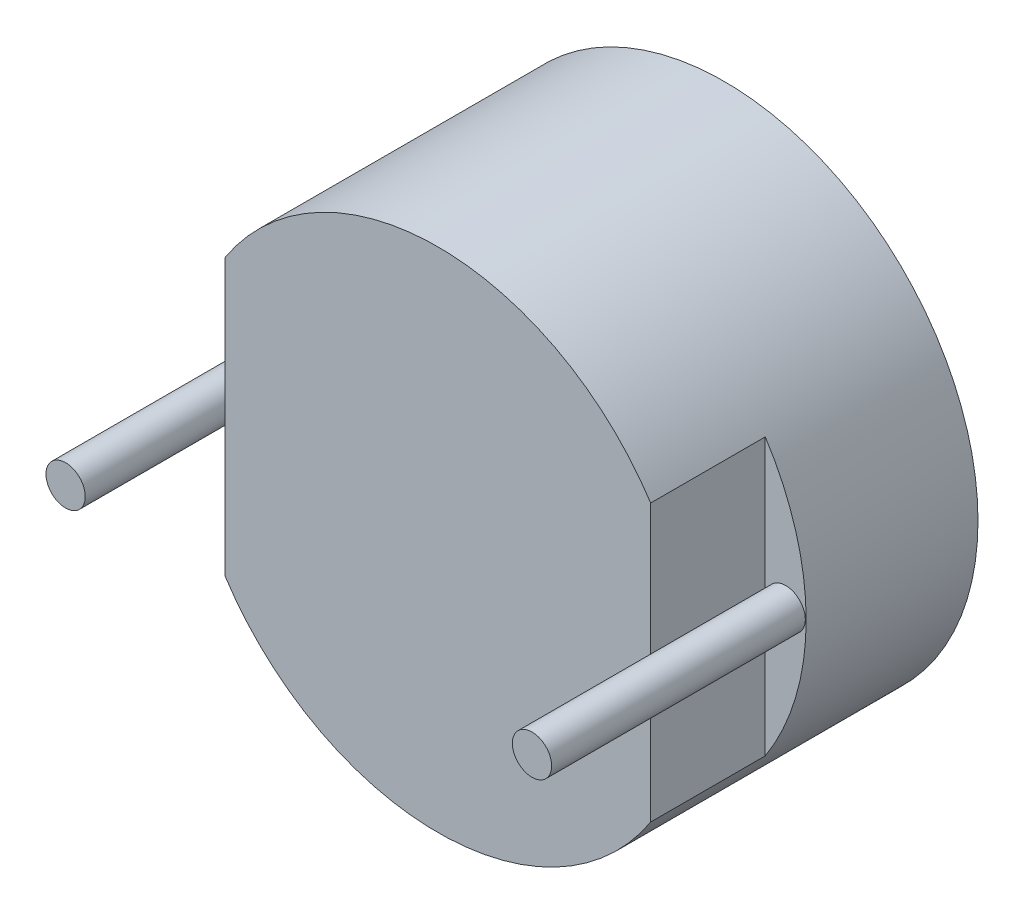
ISO-10303-21;
HEADER;
FILE_DESCRIPTION(('STEP AP214'),'2;1');
FILE_NAME('part.step','',(''),(''),'','','');
FILE_SCHEMA(('AUTOMOTIVE_DESIGN { 1 0 10303 214 1 1 1 1 }'));
ENDSEC;
DATA;
#1=APPLICATION_CONTEXT('core data for automotive mechanical design processes');
#2=APPLICATION_PROTOCOL_DEFINITION('international standard','automotive_design',2000,#1);
#3=PRODUCT_CONTEXT('',#1,'mechanical');
#4=PRODUCT('Part','Part','',(#3));
#5=PRODUCT_RELATED_PRODUCT_CATEGORY('part','',(#4));
#6=PRODUCT_DEFINITION_FORMATION('','',#4);
#7=PRODUCT_DEFINITION_CONTEXT('part definition',#1,'design');
#8=PRODUCT_DEFINITION('design','',#6,#7);
#9=PRODUCT_DEFINITION_SHAPE('','',#8);
#10=(LENGTH_UNIT() NAMED_UNIT(*) SI_UNIT(.MILLI.,.METRE.));
#11=(NAMED_UNIT(*) PLANE_ANGLE_UNIT() SI_UNIT($,.RADIAN.));
#12=(NAMED_UNIT(*) SI_UNIT($,.STERADIAN.) SOLID_ANGLE_UNIT());
#13=UNCERTAINTY_MEASURE_WITH_UNIT(LENGTH_MEASURE(1.E-05),#10,'distance_accuracy_value','');
#14=(GEOMETRIC_REPRESENTATION_CONTEXT(3) GLOBAL_UNCERTAINTY_ASSIGNED_CONTEXT((#13)) GLOBAL_UNIT_ASSIGNED_CONTEXT((#10,
#11,#12)) REPRESENTATION_CONTEXT('',''));
#15=CARTESIAN_POINT('',(0.,0.,0.));
#16=DIRECTION('',(0.,0.,1.));
#17=DIRECTION('',(1.,0.,0.));
#18=AXIS2_PLACEMENT_3D('',#15,#16,#17);
#19=CARTESIAN_POINT('',(-49.1532488000573,27.1636374947685,0.2));
#20=DIRECTION('',(0.,0.,-1.));
#21=DIRECTION('',(-1.,0.,0.));
#22=AXIS2_PLACEMENT_3D('',#19,#20,#21);
#23=PLANE('',#22);
#24=CARTESIAN_POINT('',(-49.1532488000573,27.1636374947685,0.2));
#25=DIRECTION('',(0.,0.,-1.));
#26=DIRECTION('',(-1.,0.,0.));
#27=AXIS2_PLACEMENT_3D('',#24,#25,#26);
#28=CIRCLE('',#27,2.9);
#29=CARTESIAN_POINT('',(-52.0532488000573,27.1636374947685,0.2));
#30=VERTEX_POINT('',#29);
#31=EDGE_CURVE('E179',#30,#30,#28,.T.);
#32=ORIENTED_EDGE('',*,*,#31,.T.);
#33=EDGE_LOOP('',(#32));
#34=FACE_BOUND('',#33,.T.);
#35=CARTESIAN_POINT('',(-49.1532488000573,27.1636374947685,0.2));
#36=DIRECTION('',(0.,0.,-1.));
#37=DIRECTION('',(-1.,0.,0.));
#38=AXIS2_PLACEMENT_3D('',#35,#36,#37);
#39=CIRCLE('',#38,1.675);
#40=CARTESIAN_POINT('',(-50.8282488000573,27.1636374947685,0.2));
#41=VERTEX_POINT('',#40);
#42=EDGE_CURVE('E186',#41,#41,#39,.T.);
#43=ORIENTED_EDGE('',*,*,#42,.F.);
#44=EDGE_LOOP('',(#43));
#45=FACE_BOUND('',#44,.T.);
#46=ADVANCED_FACE('F33',(#34,#45),#23,.T.);
#47=CARTESIAN_POINT('',(-49.1532488000573,27.1636374947685,2.1));
#48=DIRECTION('',(0.,0.,1.));
#49=DIRECTION('',(1.,0.,0.));
#50=AXIS2_PLACEMENT_3D('',#47,#48,#49);
#51=PLANE('',#50);
#52=DIRECTION('',(0.,1.,0.));
#53=VECTOR('',#52,1.);
#54=CARTESIAN_POINT('',(-51.7532488000573,27.1636374947685,2.1));
#55=LINE('',#54,#53);
#56=CARTESIAN_POINT('',(-51.7532488000573,25.4754431931551,2.1));
#57=VERTEX_POINT('',#56);
#58=CARTESIAN_POINT('',(-51.7532488000573,28.8518317963819,2.1));
#59=VERTEX_POINT('',#58);
#60=EDGE_CURVE('E75',#57,#59,#55,.T.);
#61=ORIENTED_EDGE('',*,*,#60,.T.);
#62=CARTESIAN_POINT('',(-49.1532488000573,27.1636374947685,2.1));
#63=DIRECTION('',(0.,0.,1.));
#64=DIRECTION('',(1.,0.,0.));
#65=AXIS2_PLACEMENT_3D('',#62,#63,#64);
#66=CIRCLE('',#65,3.1);
#67=EDGE_CURVE('E80',#59,#57,#66,.T.);
#68=ORIENTED_EDGE('',*,*,#67,.T.);
#69=EDGE_LOOP('',(#61,#68));
#70=FACE_BOUND('',#69,.T.);
#71=CARTESIAN_POINT('',(-52.0032488000573,27.1636374947685,2.1));
#72=DIRECTION('',(0.,0.,1.));
#73=DIRECTION('',(1.,0.,0.));
#74=AXIS2_PLACEMENT_3D('',#71,#72,#73);
#75=CIRCLE('',#74,0.239999999999996);
#76=CARTESIAN_POINT('',(-51.7632488000573,27.1636374947685,2.1));
#77=VERTEX_POINT('',#76);
#78=EDGE_CURVE('E175',#77,#77,#75,.T.);
#79=ORIENTED_EDGE('',*,*,#78,.F.);
#80=EDGE_LOOP('',(#79));
#81=FACE_BOUND('',#80,.T.);
#82=ADVANCED_FACE('F77',(#70,#81),#51,.T.);
#83=CARTESIAN_POINT('',(-49.1532488000573,27.1636374947685,2.1));
#84=DIRECTION('',(0.,0.,1.));
#85=DIRECTION('',(1.,0.,0.));
#86=AXIS2_PLACEMENT_3D('',#83,#84,#85);
#87=PLANE('',#86);
#88=DIRECTION('',(0.,-1.,0.));
#89=VECTOR('',#88,1.);
#90=CARTESIAN_POINT('',(-46.5532488000573,27.1636374947685,2.1));
#91=LINE('',#90,#89);
#92=CARTESIAN_POINT('',(-46.5532488000573,28.8518317963819,2.1));
#93=VERTEX_POINT('',#92);
#94=CARTESIAN_POINT('',(-46.5532488000573,25.4754431931551,2.1));
#95=VERTEX_POINT('',#94);
#96=EDGE_CURVE('E98',#93,#95,#91,.T.);
#97=ORIENTED_EDGE('',*,*,#96,.T.);
#98=CARTESIAN_POINT('',(-49.1532488000573,27.1636374947685,2.1));
#99=DIRECTION('',(0.,0.,1.));
#100=DIRECTION('',(1.,0.,0.));
#101=AXIS2_PLACEMENT_3D('',#98,#99,#100);
#102=CIRCLE('',#101,3.1);
#103=EDGE_CURVE('E100',#95,#93,#102,.T.);
#104=ORIENTED_EDGE('',*,*,#103,.T.);
#105=EDGE_LOOP('',(#97,#104));
#106=FACE_BOUND('',#105,.T.);
#107=CARTESIAN_POINT('',(-46.3032488000573,27.1636374947685,2.1));
#108=DIRECTION('',(0.,0.,1.));
#109=DIRECTION('',(1.,0.,0.));
#110=AXIS2_PLACEMENT_3D('',#107,#108,#109);
#111=CIRCLE('',#110,0.239999999999996);
#112=CARTESIAN_POINT('',(-46.0632488000573,27.1636374947685,2.1));
#113=VERTEX_POINT('',#112);
#114=EDGE_CURVE('E169',#113,#113,#111,.T.);
#115=ORIENTED_EDGE('',*,*,#114,.F.);
#116=EDGE_LOOP('',(#115));
#117=FACE_BOUND('',#116,.T.);
#118=ADVANCED_FACE('F131',(#106,#117),#87,.T.);
#119=CARTESIAN_POINT('',(-49.1532488000573,27.1636374947685,3.5));
#120=DIRECTION('',(0.,0.,-1.));
#121=DIRECTION('',(-1.,0.,0.));
#122=AXIS2_PLACEMENT_3D('',#119,#120,#121);
#123=CYLINDRICAL_SURFACE('',#122,3.1);
#124=CARTESIAN_POINT('',(-49.1532488000573,27.1636374947685,3.5));
#125=DIRECTION('',(0.,0.,1.));
#126=DIRECTION('',(1.,0.,0.));
#127=AXIS2_PLACEMENT_3D('',#124,#125,#126);
#128=CIRCLE('',#127,3.1);
#129=CARTESIAN_POINT('',(-51.7532488000573,25.4754431931551,3.5));
#130=VERTEX_POINT('',#129);
#131=CARTESIAN_POINT('',(-46.5532488000573,25.4754431931551,3.5));
#132=VERTEX_POINT('',#131);
#133=EDGE_CURVE('E42',#130,#132,#128,.T.);
#134=ORIENTED_EDGE('',*,*,#133,.F.);
#135=DIRECTION('',(0.,0.,1.));
#136=VECTOR('',#135,1.);
#137=CARTESIAN_POINT('',(-51.7532488000573,25.4754431931551,2.1));
#138=LINE('',#137,#136);
#139=EDGE_CURVE('E49',#57,#130,#138,.T.);
#140=ORIENTED_EDGE('',*,*,#139,.F.);
#141=ORIENTED_EDGE('',*,*,#67,.F.);
#142=DIRECTION('',(0.,0.,1.));
#143=VECTOR('',#142,1.);
#144=CARTESIAN_POINT('',(-51.7532488000573,28.8518317963819,2.1));
#145=LINE('',#144,#143);
#146=CARTESIAN_POINT('',(-51.7532488000573,28.8518317963819,3.5));
#147=VERTEX_POINT('',#146);
#148=EDGE_CURVE('E84',#59,#147,#145,.T.);
#149=ORIENTED_EDGE('',*,*,#148,.T.);
#150=CARTESIAN_POINT('',(-46.5532488000573,28.8518317963819,3.5));
#151=VERTEX_POINT('',#150);
#152=EDGE_CURVE('E11',#151,#147,#128,.T.);
#153=ORIENTED_EDGE('',*,*,#152,.F.);
#154=DIRECTION('',(0.,0.,1.));
#155=VECTOR('',#154,1.);
#156=CARTESIAN_POINT('',(-46.5532488000573,28.8518317963819,2.1));
#157=LINE('',#156,#155);
#158=EDGE_CURVE('E57',#93,#151,#157,.T.);
#159=ORIENTED_EDGE('',*,*,#158,.F.);
#160=ORIENTED_EDGE('',*,*,#103,.F.);
#161=DIRECTION('',(0.,0.,1.));
#162=VECTOR('',#161,1.);
#163=CARTESIAN_POINT('',(-46.5532488000573,25.4754431931551,2.1));
#164=LINE('',#163,#162);
#165=EDGE_CURVE('E103',#95,#132,#164,.T.);
#166=ORIENTED_EDGE('',*,*,#165,.T.);
#167=EDGE_LOOP('',(#134,#140,#141,#149,#153,#159,#160,#166));
#168=FACE_BOUND('',#167,.T.);
#169=CARTESIAN_POINT('',(-49.1532488000573,27.1636374947685,0.));
#170=DIRECTION('',(0.,0.,1.));
#171=DIRECTION('',(1.,0.,0.));
#172=AXIS2_PLACEMENT_3D('',#169,#170,#171);
#173=CIRCLE('',#172,3.1);
#174=CARTESIAN_POINT('',(-46.0532488000573,27.1636374947685,0.));
#175=VERTEX_POINT('',#174);
#176=EDGE_CURVE('E37',#175,#175,#173,.T.);
#177=ORIENTED_EDGE('',*,*,#176,.T.);
#178=EDGE_LOOP('',(#177));
#179=FACE_BOUND('',#178,.T.);
#180=ADVANCED_FACE('F35',(#168,#179),#123,.T.);
#181=CARTESIAN_POINT('',(-49.1532488000573,27.1636374947685,3.5));
#182=DIRECTION('',(0.,0.,1.));
#183=DIRECTION('',(1.,0.,0.));
#184=AXIS2_PLACEMENT_3D('',#181,#182,#183);
#185=PLANE('',#184);
#186=DIRECTION('',(0.,1.,0.));
#187=VECTOR('',#186,1.);
#188=CARTESIAN_POINT('',(-51.7532488000573,27.1636374947685,3.5));
#189=LINE('',#188,#187);
#190=EDGE_CURVE('E81',#130,#147,#189,.T.);
#191=ORIENTED_EDGE('',*,*,#190,.F.);
#192=ORIENTED_EDGE('',*,*,#133,.T.);
#193=DIRECTION('',(0.,-1.,0.));
#194=VECTOR('',#193,1.);
#195=CARTESIAN_POINT('',(-46.5532488000573,27.1636374947685,3.5));
#196=LINE('',#195,#194);
#197=EDGE_CURVE('E96',#151,#132,#196,.T.);
#198=ORIENTED_EDGE('',*,*,#197,.F.);
#199=ORIENTED_EDGE('',*,*,#152,.T.);
#200=EDGE_LOOP('',(#191,#192,#198,#199));
#201=FACE_BOUND('',#200,.T.);
#202=ADVANCED_FACE('F111',(#201),#185,.T.);
#203=CARTESIAN_POINT('',(-49.1532488000573,27.1636374947685,0.));
#204=DIRECTION('',(0.,0.,1.));
#205=DIRECTION('',(1.,0.,0.));
#206=AXIS2_PLACEMENT_3D('',#203,#204,#205);
#207=PLANE('',#206);
#208=CARTESIAN_POINT('',(-49.1532488000573,27.1636374947685,0.));
#209=DIRECTION('',(0.,0.,-1.));
#210=DIRECTION('',(-1.,0.,0.));
#211=AXIS2_PLACEMENT_3D('',#208,#209,#210);
#212=CIRCLE('',#211,2.9);
#213=CARTESIAN_POINT('',(-52.0532488000573,27.1636374947685,0.));
#214=VERTEX_POINT('',#213);
#215=EDGE_CURVE('E181',#214,#214,#212,.T.);
#216=ORIENTED_EDGE('',*,*,#215,.F.);
#217=EDGE_LOOP('',(#216));
#218=FACE_BOUND('',#217,.T.);
#219=ORIENTED_EDGE('',*,*,#176,.F.);
#220=EDGE_LOOP('',(#219));
#221=FACE_BOUND('',#220,.T.);
#222=ADVANCED_FACE('F115',(#218,#221),#207,.F.);
#223=CARTESIAN_POINT('',(-46.5532488000573,27.1636374947685,2.1));
#224=DIRECTION('',(-1.,0.,0.));
#225=DIRECTION('',(0.,0.,1.));
#226=AXIS2_PLACEMENT_3D('',#223,#224,#225);
#227=PLANE('',#226);
#228=ORIENTED_EDGE('',*,*,#197,.T.);
#229=ORIENTED_EDGE('',*,*,#165,.F.);
#230=ORIENTED_EDGE('',*,*,#96,.F.);
#231=ORIENTED_EDGE('',*,*,#158,.T.);
#232=EDGE_LOOP('',(#228,#229,#230,#231));
#233=FACE_BOUND('',#232,.T.);
#234=ADVANCED_FACE('F109',(#233),#227,.F.);
#235=CARTESIAN_POINT('',(-51.7532488000573,27.1636374947685,2.1));
#236=DIRECTION('',(1.,0.,0.));
#237=DIRECTION('',(0.,0.,-1.));
#238=AXIS2_PLACEMENT_3D('',#235,#236,#237);
#239=PLANE('',#238);
#240=ORIENTED_EDGE('',*,*,#190,.T.);
#241=ORIENTED_EDGE('',*,*,#148,.F.);
#242=ORIENTED_EDGE('',*,*,#60,.F.);
#243=ORIENTED_EDGE('',*,*,#139,.T.);
#244=EDGE_LOOP('',(#240,#241,#242,#243));
#245=FACE_BOUND('',#244,.T.);
#246=ADVANCED_FACE('F85',(#245),#239,.F.);
#247=CARTESIAN_POINT('',(-46.3032488000573,27.1636374947685,5.2));
#248=DIRECTION('',(0.,0.,-1.));
#249=DIRECTION('',(-1.,0.,0.));
#250=AXIS2_PLACEMENT_3D('',#247,#248,#249);
#251=CYLINDRICAL_SURFACE('',#250,0.239999999999996);
#252=CARTESIAN_POINT('',(-46.3032488000573,27.1636374947685,5.2));
#253=DIRECTION('',(0.,0.,1.));
#254=DIRECTION('',(1.,0.,0.));
#255=AXIS2_PLACEMENT_3D('',#252,#253,#254);
#256=CIRCLE('',#255,0.239999999999996);
#257=CARTESIAN_POINT('',(-46.0632488000573,27.1636374947685,5.2));
#258=VERTEX_POINT('',#257);
#259=EDGE_CURVE('E95',#258,#258,#256,.T.);
#260=ORIENTED_EDGE('',*,*,#259,.F.);
#261=EDGE_LOOP('',(#260));
#262=FACE_BOUND('',#261,.T.);
#263=ORIENTED_EDGE('',*,*,#114,.T.);
#264=EDGE_LOOP('',(#263));
#265=FACE_BOUND('',#264,.T.);
#266=ADVANCED_FACE('F154',(#262,#265),#251,.T.);
#267=CARTESIAN_POINT('',(-46.3032488000573,27.1636374947685,5.2));
#268=DIRECTION('',(0.,0.,1.));
#269=DIRECTION('',(1.,0.,0.));
#270=AXIS2_PLACEMENT_3D('',#267,#268,#269);
#271=PLANE('',#270);
#272=ORIENTED_EDGE('',*,*,#259,.T.);
#273=EDGE_LOOP('',(#272));
#274=FACE_BOUND('',#273,.T.);
#275=ADVANCED_FACE('F150',(#274),#271,.T.);
#276=CARTESIAN_POINT('',(-52.0032488000573,27.1636374947685,5.2));
#277=DIRECTION('',(0.,0.,-1.));
#278=DIRECTION('',(-1.,0.,0.));
#279=AXIS2_PLACEMENT_3D('',#276,#277,#278);
#280=CYLINDRICAL_SURFACE('',#279,0.239999999999996);
#281=CARTESIAN_POINT('',(-52.0032488000573,27.1636374947685,5.2));
#282=DIRECTION('',(0.,0.,1.));
#283=DIRECTION('',(1.,0.,0.));
#284=AXIS2_PLACEMENT_3D('',#281,#282,#283);
#285=CIRCLE('',#284,0.239999999999996);
#286=CARTESIAN_POINT('',(-51.7632488000573,27.1636374947685,5.2));
#287=VERTEX_POINT('',#286);
#288=EDGE_CURVE('E171',#287,#287,#285,.T.);
#289=ORIENTED_EDGE('',*,*,#288,.F.);
#290=EDGE_LOOP('',(#289));
#291=FACE_BOUND('',#290,.T.);
#292=ORIENTED_EDGE('',*,*,#78,.T.);
#293=EDGE_LOOP('',(#292));
#294=FACE_BOUND('',#293,.T.);
#295=ADVANCED_FACE('F146',(#291,#294),#280,.T.);
#296=CARTESIAN_POINT('',(-52.0032488000573,27.1636374947685,5.2));
#297=DIRECTION('',(0.,0.,1.));
#298=DIRECTION('',(1.,0.,0.));
#299=AXIS2_PLACEMENT_3D('',#296,#297,#298);
#300=PLANE('',#299);
#301=ORIENTED_EDGE('',*,*,#288,.T.);
#302=EDGE_LOOP('',(#301));
#303=FACE_BOUND('',#302,.T.);
#304=ADVANCED_FACE('F142',(#303),#300,.T.);
#305=CARTESIAN_POINT('',(-49.1532488000573,27.1636374947685,0.2));
#306=DIRECTION('',(0.,0.,-1.));
#307=DIRECTION('',(-1.,0.,0.));
#308=AXIS2_PLACEMENT_3D('',#305,#306,#307);
#309=CYLINDRICAL_SURFACE('',#308,2.9);
#310=ORIENTED_EDGE('',*,*,#31,.F.);
#311=EDGE_LOOP('',(#310));
#312=FACE_BOUND('',#311,.T.);
#313=ORIENTED_EDGE('',*,*,#215,.T.);
#314=EDGE_LOOP('',(#313));
#315=FACE_BOUND('',#314,.T.);
#316=ADVANCED_FACE('F139',(#312,#315),#309,.F.);
#317=CARTESIAN_POINT('',(-49.1532488000573,27.1636374947685,-0.8));
#318=DIRECTION('',(0.,0.,1.));
#319=DIRECTION('',(1.,0.,0.));
#320=AXIS2_PLACEMENT_3D('',#317,#318,#319);
#321=CYLINDRICAL_SURFACE('',#320,1.675);
#322=CARTESIAN_POINT('',(-49.1532488000573,27.1636374947685,-0.8));
#323=DIRECTION('',(0.,0.,-1.));
#324=DIRECTION('',(-1.,0.,0.));
#325=AXIS2_PLACEMENT_3D('',#322,#323,#324);
#326=CIRCLE('',#325,1.675);
#327=CARTESIAN_POINT('',(-50.8282488000573,27.1636374947685,-0.8));
#328=VERTEX_POINT('',#327);
#329=EDGE_CURVE('E184',#328,#328,#326,.T.);
#330=ORIENTED_EDGE('',*,*,#329,.F.);
#331=EDGE_LOOP('',(#330));
#332=FACE_BOUND('',#331,.T.);
#333=ORIENTED_EDGE('',*,*,#42,.T.);
#334=EDGE_LOOP('',(#333));
#335=FACE_BOUND('',#334,.T.);
#336=ADVANCED_FACE('F137',(#332,#335),#321,.T.);
#337=CARTESIAN_POINT('',(-49.1532488000573,27.1636374947685,-0.8));
#338=DIRECTION('',(0.,0.,-1.));
#339=DIRECTION('',(-1.,0.,0.));
#340=AXIS2_PLACEMENT_3D('',#337,#338,#339);
#341=PLANE('',#340);
#342=ORIENTED_EDGE('',*,*,#329,.T.);
#343=EDGE_LOOP('',(#342));
#344=FACE_BOUND('',#343,.T.);
#345=ADVANCED_FACE('F192',(#344),#341,.T.);
#346=CLOSED_SHELL('',(#46,#82,#118,#180,#202,#222,#234,#246,#266,#275,#295,#304,#316,#336,#345));
#347=MANIFOLD_SOLID_BREP('B2',#346);
#348=ADVANCED_BREP_SHAPE_REPRESENTATION('',(#18,#347),#14);
#349=SHAPE_DEFINITION_REPRESENTATION(#9,#348);
ENDSEC;
END-ISO-10303-21;
